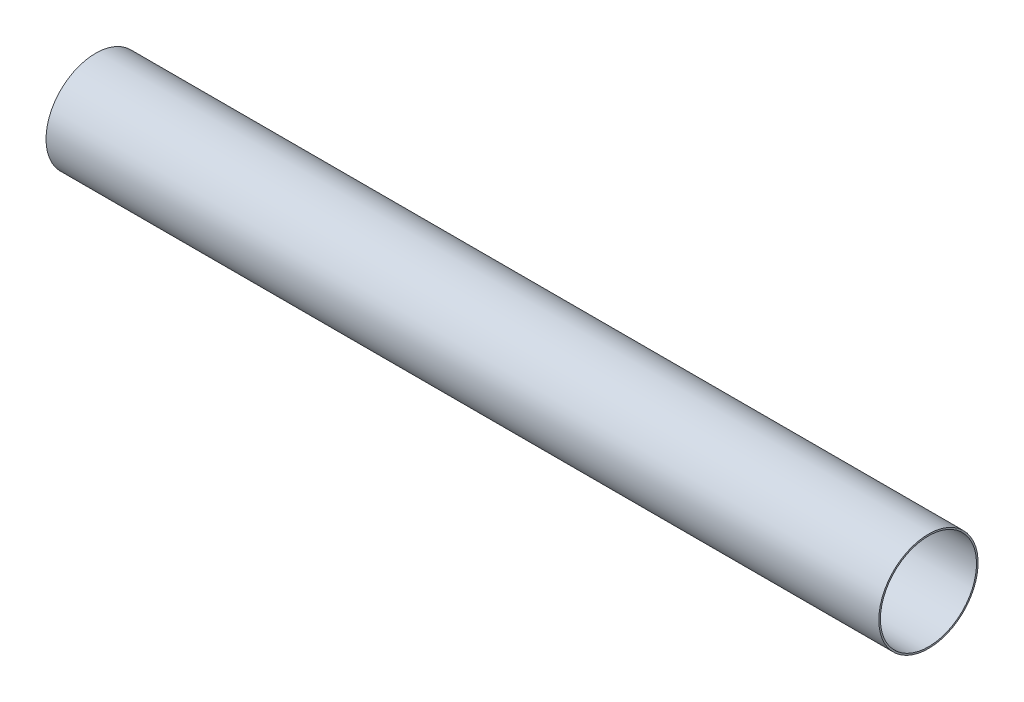
ISO-10303-21;
HEADER;
FILE_DESCRIPTION(('STEP AP214'),'2;1');
FILE_NAME('part.step','',(''),(''),'','','');
FILE_SCHEMA(('AUTOMOTIVE_DESIGN { 1 0 10303 214 1 1 1 1 }'));
ENDSEC;
DATA;
#1=APPLICATION_CONTEXT('core data for automotive mechanical design processes');
#2=APPLICATION_PROTOCOL_DEFINITION('international standard','automotive_design',2000,#1);
#3=PRODUCT_CONTEXT('',#1,'mechanical');
#4=PRODUCT('Part','Part','',(#3));
#5=PRODUCT_RELATED_PRODUCT_CATEGORY('part','',(#4));
#6=PRODUCT_DEFINITION_FORMATION('','',#4);
#7=PRODUCT_DEFINITION_CONTEXT('part definition',#1,'design');
#8=PRODUCT_DEFINITION('design','',#6,#7);
#9=PRODUCT_DEFINITION_SHAPE('','',#8);
#10=(LENGTH_UNIT() NAMED_UNIT(*) SI_UNIT(.MILLI.,.METRE.));
#11=(NAMED_UNIT(*) PLANE_ANGLE_UNIT() SI_UNIT($,.RADIAN.));
#12=(NAMED_UNIT(*) SI_UNIT($,.STERADIAN.) SOLID_ANGLE_UNIT());
#13=UNCERTAINTY_MEASURE_WITH_UNIT(LENGTH_MEASURE(1.E-05),#10,'distance_accuracy_value','');
#14=(GEOMETRIC_REPRESENTATION_CONTEXT(3) GLOBAL_UNCERTAINTY_ASSIGNED_CONTEXT((#13)) GLOBAL_UNIT_ASSIGNED_CONTEXT((#10,
#11,#12)) REPRESENTATION_CONTEXT('',''));
#15=CARTESIAN_POINT('',(0.,0.,0.));
#16=DIRECTION('',(0.,0.,1.));
#17=DIRECTION('',(1.,0.,0.));
#18=AXIS2_PLACEMENT_3D('',#15,#16,#17);
#19=CARTESIAN_POINT('',(0.,77.47,0.));
#20=DIRECTION('',(1.,0.,0.));
#21=DIRECTION('',(0.,0.,-1.));
#22=AXIS2_PLACEMENT_3D('',#19,#20,#21);
#23=PLANE('',#22);
#24=CARTESIAN_POINT('',(0.,0.,0.));
#25=DIRECTION('',(-1.,0.,0.));
#26=DIRECTION('',(0.,0.,1.));
#27=AXIS2_PLACEMENT_3D('',#24,#25,#26);
#28=CIRCLE('',#27,75.);
#29=CARTESIAN_POINT('',(0.,0.,75.));
#30=VERTEX_POINT('',#29);
#31=EDGE_CURVE('E10',#30,#30,#28,.T.);
#32=ORIENTED_EDGE('',*,*,#31,.F.);
#33=EDGE_LOOP('',(#32));
#34=FACE_BOUND('',#33,.T.);
#35=CARTESIAN_POINT('',(0.,0.,0.));
#36=DIRECTION('',(-1.,0.,0.));
#37=DIRECTION('',(0.,0.,1.));
#38=AXIS2_PLACEMENT_3D('',#35,#36,#37);
#39=CIRCLE('',#38,77.47);
#40=CARTESIAN_POINT('',(0.,0.,77.47));
#41=VERTEX_POINT('',#40);
#42=EDGE_CURVE('E45',#41,#41,#39,.T.);
#43=ORIENTED_EDGE('',*,*,#42,.T.);
#44=EDGE_LOOP('',(#43));
#45=FACE_BOUND('',#44,.T.);
#46=ADVANCED_FACE('F31',(#34,#45),#23,.F.);
#47=CARTESIAN_POINT('',(0.,0.,0.));
#48=DIRECTION('',(-1.,0.,0.));
#49=DIRECTION('',(0.,0.,1.));
#50=AXIS2_PLACEMENT_3D('',#47,#48,#49);
#51=CYLINDRICAL_SURFACE('',#50,75.);
#52=CARTESIAN_POINT('',(1300.,0.,0.));
#53=DIRECTION('',(-1.,0.,0.));
#54=DIRECTION('',(0.,0.,1.));
#55=AXIS2_PLACEMENT_3D('',#52,#53,#54);
#56=CIRCLE('',#55,75.);
#57=CARTESIAN_POINT('',(1300.,0.,75.));
#58=VERTEX_POINT('',#57);
#59=EDGE_CURVE('E37',#58,#58,#56,.T.);
#60=ORIENTED_EDGE('',*,*,#59,.F.);
#61=EDGE_LOOP('',(#60));
#62=FACE_BOUND('',#61,.T.);
#63=ORIENTED_EDGE('',*,*,#31,.T.);
#64=EDGE_LOOP('',(#63));
#65=FACE_BOUND('',#64,.T.);
#66=ADVANCED_FACE('F60',(#62,#65),#51,.F.);
#67=CARTESIAN_POINT('',(1300.,77.47,0.));
#68=DIRECTION('',(-1.,0.,0.));
#69=DIRECTION('',(0.,0.,1.));
#70=AXIS2_PLACEMENT_3D('',#67,#68,#69);
#71=PLANE('',#70);
#72=CARTESIAN_POINT('',(1300.,0.,0.));
#73=DIRECTION('',(-1.,0.,0.));
#74=DIRECTION('',(0.,0.,1.));
#75=AXIS2_PLACEMENT_3D('',#72,#73,#74);
#76=CIRCLE('',#75,77.47);
#77=CARTESIAN_POINT('',(1300.,0.,77.47));
#78=VERTEX_POINT('',#77);
#79=EDGE_CURVE('E41',#78,#78,#76,.T.);
#80=ORIENTED_EDGE('',*,*,#79,.F.);
#81=EDGE_LOOP('',(#80));
#82=FACE_BOUND('',#81,.T.);
#83=ORIENTED_EDGE('',*,*,#59,.T.);
#84=EDGE_LOOP('',(#83));
#85=FACE_BOUND('',#84,.T.);
#86=ADVANCED_FACE('F55',(#82,#85),#71,.F.);
#87=CARTESIAN_POINT('',(0.,0.,0.));
#88=DIRECTION('',(-1.,0.,0.));
#89=DIRECTION('',(0.,0.,1.));
#90=AXIS2_PLACEMENT_3D('',#87,#88,#89);
#91=CYLINDRICAL_SURFACE('',#90,77.47);
#92=ORIENTED_EDGE('',*,*,#42,.F.);
#93=EDGE_LOOP('',(#92));
#94=FACE_BOUND('',#93,.T.);
#95=ORIENTED_EDGE('',*,*,#79,.T.);
#96=EDGE_LOOP('',(#95));
#97=FACE_BOUND('',#96,.T.);
#98=ADVANCED_FACE('F52',(#94,#97),#91,.T.);
#99=CLOSED_SHELL('',(#46,#66,#86,#98));
#100=MANIFOLD_SOLID_BREP('B2',#99);
#101=ADVANCED_BREP_SHAPE_REPRESENTATION('',(#18,#100),#14);
#102=SHAPE_DEFINITION_REPRESENTATION(#9,#101);
ENDSEC;
END-ISO-10303-21;
